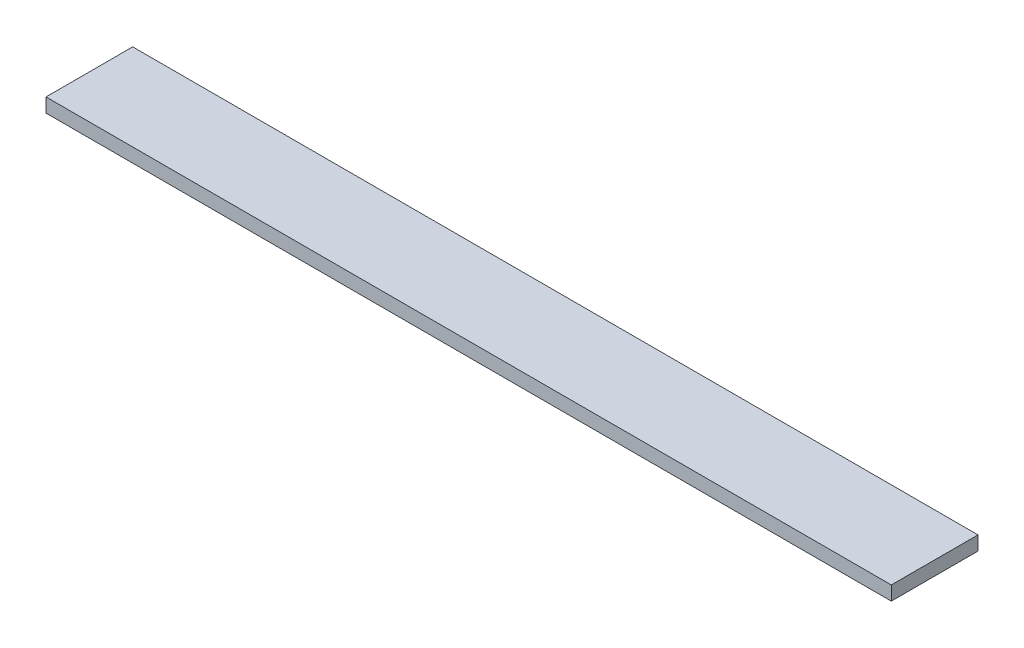
ISO-10303-21;
HEADER;
FILE_DESCRIPTION(('STEP AP214'),'2;1');
FILE_NAME('part.step','',(''),(''),'','','');
FILE_SCHEMA(('AUTOMOTIVE_DESIGN { 1 0 10303 214 1 1 1 1 }'));
ENDSEC;
DATA;
#1=APPLICATION_CONTEXT('core data for automotive mechanical design processes');
#2=APPLICATION_PROTOCOL_DEFINITION('international standard','automotive_design',2000,#1);
#3=PRODUCT_CONTEXT('',#1,'mechanical');
#4=PRODUCT('Part','Part','',(#3));
#5=PRODUCT_RELATED_PRODUCT_CATEGORY('part','',(#4));
#6=PRODUCT_DEFINITION_FORMATION('','',#4);
#7=PRODUCT_DEFINITION_CONTEXT('part definition',#1,'design');
#8=PRODUCT_DEFINITION('design','',#6,#7);
#9=PRODUCT_DEFINITION_SHAPE('','',#8);
#10=(LENGTH_UNIT() NAMED_UNIT(*) SI_UNIT(.MILLI.,.METRE.));
#11=(NAMED_UNIT(*) PLANE_ANGLE_UNIT() SI_UNIT($,.RADIAN.));
#12=(NAMED_UNIT(*) SI_UNIT($,.STERADIAN.) SOLID_ANGLE_UNIT());
#13=UNCERTAINTY_MEASURE_WITH_UNIT(LENGTH_MEASURE(1.E-05),#10,'distance_accuracy_value','');
#14=(GEOMETRIC_REPRESENTATION_CONTEXT(3) GLOBAL_UNCERTAINTY_ASSIGNED_CONTEXT((#13)) GLOBAL_UNIT_ASSIGNED_CONTEXT((#10,
#11,#12)) REPRESENTATION_CONTEXT('',''));
#15=CARTESIAN_POINT('',(0.,0.,0.));
#16=DIRECTION('',(0.,0.,1.));
#17=DIRECTION('',(1.,0.,0.));
#18=AXIS2_PLACEMENT_3D('',#15,#16,#17);
#19=CARTESIAN_POINT('',(-3139.41676829268,21.59,-959.266234756096));
#20=DIRECTION('',(1.,0.,0.));
#21=DIRECTION('',(0.,0.,-1.));
#22=AXIS2_PLACEMENT_3D('',#19,#20,#21);
#23=PLANE('',#22);
#24=DIRECTION('',(0.,0.,1.));
#25=VECTOR('',#24,1.);
#26=CARTESIAN_POINT('',(-3139.41676829268,0.,-959.266234756096));
#27=LINE('',#26,#25);
#28=CARTESIAN_POINT('',(-3139.41676829268,0.,-959.266234756096));
#29=VERTEX_POINT('',#28);
#30=CARTESIAN_POINT('',(-3139.41676829268,0.,-825.916234756096));
#31=VERTEX_POINT('',#30);
#32=EDGE_CURVE('E96',#29,#31,#27,.T.);
#33=ORIENTED_EDGE('',*,*,#32,.T.);
#34=DIRECTION('',(0.,-1.,0.));
#35=VECTOR('',#34,1.);
#36=CARTESIAN_POINT('',(-3139.41676829268,21.59,-825.916234756096));
#37=LINE('',#36,#35);
#38=CARTESIAN_POINT('',(-3139.41676829268,21.59,-825.916234756096));
#39=VERTEX_POINT('',#38);
#40=EDGE_CURVE('E11',#39,#31,#37,.T.);
#41=ORIENTED_EDGE('',*,*,#40,.F.);
#42=DIRECTION('',(0.,0.,1.));
#43=VECTOR('',#42,1.);
#44=CARTESIAN_POINT('',(-3139.41676829268,21.59,-959.266234756096));
#45=LINE('',#44,#43);
#46=CARTESIAN_POINT('',(-3139.41676829268,21.59,-959.266234756096));
#47=VERTEX_POINT('',#46);
#48=EDGE_CURVE('E84',#47,#39,#45,.T.);
#49=ORIENTED_EDGE('',*,*,#48,.F.);
#50=DIRECTION('',(0.,-1.,0.));
#51=VECTOR('',#50,1.);
#52=CARTESIAN_POINT('',(-3139.41676829268,21.59,-959.266234756096));
#53=LINE('',#52,#51);
#54=EDGE_CURVE('E92',#47,#29,#53,.T.);
#55=ORIENTED_EDGE('',*,*,#54,.T.);
#56=EDGE_LOOP('',(#33,#41,#49,#55));
#57=FACE_BOUND('',#56,.T.);
#58=ADVANCED_FACE('F33',(#57),#23,.F.);
#59=CARTESIAN_POINT('',(-3139.41676829268,21.59,-825.916234756096));
#60=DIRECTION('',(0.,0.,-1.));
#61=DIRECTION('',(-1.,0.,0.));
#62=AXIS2_PLACEMENT_3D('',#59,#60,#61);
#63=PLANE('',#62);
#64=DIRECTION('',(1.,0.,0.));
#65=VECTOR('',#64,1.);
#66=CARTESIAN_POINT('',(-3139.41676829268,0.,-825.916234756096));
#67=LINE('',#66,#65);
#68=CARTESIAN_POINT('',(-1839.25426829268,0.,-825.916234756096));
#69=VERTEX_POINT('',#68);
#70=EDGE_CURVE('E88',#31,#69,#67,.T.);
#71=ORIENTED_EDGE('',*,*,#70,.T.);
#72=DIRECTION('',(0.,-1.,0.));
#73=VECTOR('',#72,1.);
#74=CARTESIAN_POINT('',(-1839.25426829268,21.59,-825.916234756096));
#75=LINE('',#74,#73);
#76=CARTESIAN_POINT('',(-1839.25426829268,21.59,-825.916234756096));
#77=VERTEX_POINT('',#76);
#78=EDGE_CURVE('E41',#77,#69,#75,.T.);
#79=ORIENTED_EDGE('',*,*,#78,.F.);
#80=DIRECTION('',(1.,0.,0.));
#81=VECTOR('',#80,1.);
#82=CARTESIAN_POINT('',(-3139.41676829268,21.59,-825.916234756096));
#83=LINE('',#82,#81);
#84=EDGE_CURVE('E79',#39,#77,#83,.T.);
#85=ORIENTED_EDGE('',*,*,#84,.F.);
#86=ORIENTED_EDGE('',*,*,#40,.T.);
#87=EDGE_LOOP('',(#71,#79,#85,#86));
#88=FACE_BOUND('',#87,.T.);
#89=ADVANCED_FACE('F87',(#88),#63,.F.);
#90=CARTESIAN_POINT('',(-1839.25426829268,21.59,-959.266234756096));
#91=DIRECTION('',(-1.,0.,0.));
#92=DIRECTION('',(0.,0.,1.));
#93=AXIS2_PLACEMENT_3D('',#90,#91,#92);
#94=PLANE('',#93);
#95=DIRECTION('',(0.,0.,-1.));
#96=VECTOR('',#95,1.);
#97=CARTESIAN_POINT('',(-1839.25426829268,0.,-959.266234756096));
#98=LINE('',#97,#96);
#99=CARTESIAN_POINT('',(-1839.25426829268,0.,-959.266234756096));
#100=VERTEX_POINT('',#99);
#101=EDGE_CURVE('E66',#69,#100,#98,.T.);
#102=ORIENTED_EDGE('',*,*,#101,.T.);
#103=DIRECTION('',(0.,-1.,0.));
#104=VECTOR('',#103,1.);
#105=CARTESIAN_POINT('',(-1839.25426829268,21.59,-959.266234756096));
#106=LINE('',#105,#104);
#107=CARTESIAN_POINT('',(-1839.25426829268,21.59,-959.266234756096));
#108=VERTEX_POINT('',#107);
#109=EDGE_CURVE('E89',#108,#100,#106,.T.);
#110=ORIENTED_EDGE('',*,*,#109,.F.);
#111=DIRECTION('',(0.,0.,-1.));
#112=VECTOR('',#111,1.);
#113=CARTESIAN_POINT('',(-1839.25426829268,21.59,-959.266234756096));
#114=LINE('',#113,#112);
#115=EDGE_CURVE('E82',#77,#108,#114,.T.);
#116=ORIENTED_EDGE('',*,*,#115,.F.);
#117=ORIENTED_EDGE('',*,*,#78,.T.);
#118=EDGE_LOOP('',(#102,#110,#116,#117));
#119=FACE_BOUND('',#118,.T.);
#120=ADVANCED_FACE('F90',(#119),#94,.F.);
#121=CARTESIAN_POINT('',(-3139.41676829268,21.59,-959.266234756096));
#122=DIRECTION('',(0.,0.,1.));
#123=DIRECTION('',(1.,0.,0.));
#124=AXIS2_PLACEMENT_3D('',#121,#122,#123);
#125=PLANE('',#124);
#126=DIRECTION('',(-1.,0.,0.));
#127=VECTOR('',#126,1.);
#128=CARTESIAN_POINT('',(-3139.41676829268,0.,-959.266234756096));
#129=LINE('',#128,#127);
#130=EDGE_CURVE('E72',#100,#29,#129,.T.);
#131=ORIENTED_EDGE('',*,*,#130,.T.);
#132=ORIENTED_EDGE('',*,*,#54,.F.);
#133=DIRECTION('',(-1.,0.,0.));
#134=VECTOR('',#133,1.);
#135=CARTESIAN_POINT('',(-3139.41676829268,21.59,-959.266234756096));
#136=LINE('',#135,#134);
#137=EDGE_CURVE('E49',#108,#47,#136,.T.);
#138=ORIENTED_EDGE('',*,*,#137,.F.);
#139=ORIENTED_EDGE('',*,*,#109,.T.);
#140=EDGE_LOOP('',(#131,#132,#138,#139));
#141=FACE_BOUND('',#140,.T.);
#142=ADVANCED_FACE('F103',(#141),#125,.F.);
#143=CARTESIAN_POINT('',(0.,21.59,0.));
#144=DIRECTION('',(0.,1.,0.));
#145=DIRECTION('',(0.,0.,1.));
#146=AXIS2_PLACEMENT_3D('',#143,#144,#145);
#147=PLANE('',#146);
#148=ORIENTED_EDGE('',*,*,#48,.T.);
#149=ORIENTED_EDGE('',*,*,#84,.T.);
#150=ORIENTED_EDGE('',*,*,#115,.T.);
#151=ORIENTED_EDGE('',*,*,#137,.T.);
#152=EDGE_LOOP('',(#148,#149,#150,#151));
#153=FACE_BOUND('',#152,.T.);
#154=ADVANCED_FACE('F80',(#153),#147,.T.);
#155=CARTESIAN_POINT('',(0.,0.,0.));
#156=DIRECTION('',(0.,1.,0.));
#157=DIRECTION('',(0.,0.,1.));
#158=AXIS2_PLACEMENT_3D('',#155,#156,#157);
#159=PLANE('',#158);
#160=ORIENTED_EDGE('',*,*,#32,.F.);
#161=ORIENTED_EDGE('',*,*,#130,.F.);
#162=ORIENTED_EDGE('',*,*,#101,.F.);
#163=ORIENTED_EDGE('',*,*,#70,.F.);
#164=EDGE_LOOP('',(#160,#161,#162,#163));
#165=FACE_BOUND('',#164,.T.);
#166=ADVANCED_FACE('F106',(#165),#159,.F.);
#167=CLOSED_SHELL('',(#58,#89,#120,#142,#154,#166));
#168=MANIFOLD_SOLID_BREP('B2',#167);
#169=ADVANCED_BREP_SHAPE_REPRESENTATION('',(#18,#168),#14);
#170=SHAPE_DEFINITION_REPRESENTATION(#9,#169);
ENDSEC;
END-ISO-10303-21;
